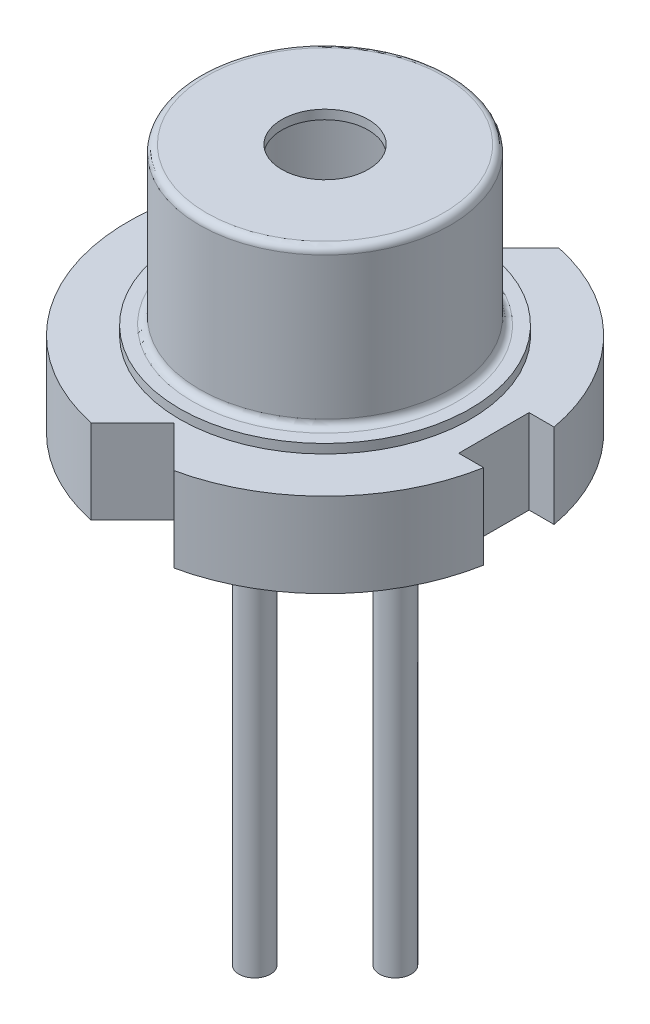
ISO-10303-21;
HEADER;
FILE_DESCRIPTION(('STEP AP214'),'2;1');
FILE_NAME('part.step','',(''),(''),'','','');
FILE_SCHEMA(('AUTOMOTIVE_DESIGN { 1 0 10303 214 1 1 1 1 }'));
ENDSEC;
DATA;
#1=APPLICATION_CONTEXT('core data for automotive mechanical design processes');
#2=APPLICATION_PROTOCOL_DEFINITION('international standard','automotive_design',2000,#1);
#3=PRODUCT_CONTEXT('',#1,'mechanical');
#4=PRODUCT('Part','Part','',(#3));
#5=PRODUCT_RELATED_PRODUCT_CATEGORY('part','',(#4));
#6=PRODUCT_DEFINITION_FORMATION('','',#4);
#7=PRODUCT_DEFINITION_CONTEXT('part definition',#1,'design');
#8=PRODUCT_DEFINITION('design','',#6,#7);
#9=PRODUCT_DEFINITION_SHAPE('','',#8);
#10=(LENGTH_UNIT() NAMED_UNIT(*) SI_UNIT(.MILLI.,.METRE.));
#11=(NAMED_UNIT(*) PLANE_ANGLE_UNIT() SI_UNIT($,.RADIAN.));
#12=(NAMED_UNIT(*) SI_UNIT($,.STERADIAN.) SOLID_ANGLE_UNIT());
#13=UNCERTAINTY_MEASURE_WITH_UNIT(LENGTH_MEASURE(1.E-05),#10,'distance_accuracy_value','');
#14=(GEOMETRIC_REPRESENTATION_CONTEXT(3) GLOBAL_UNCERTAINTY_ASSIGNED_CONTEXT((#13)) GLOBAL_UNIT_ASSIGNED_CONTEXT((#10,
#11,#12)) REPRESENTATION_CONTEXT('',''));
#15=CARTESIAN_POINT('',(0.,0.,0.));
#16=DIRECTION('',(0.,0.,1.));
#17=DIRECTION('',(1.,0.,0.));
#18=AXIS2_PLACEMENT_3D('',#15,#16,#17);
#19=CARTESIAN_POINT('',(0.,1.2,0.));
#20=DIRECTION('',(0.,-1.,0.));
#21=DIRECTION('',(0.,0.,-1.));
#22=AXIS2_PLACEMENT_3D('',#19,#20,#21);
#23=CYLINDRICAL_SURFACE('',#22,2.8);
#24=CARTESIAN_POINT('',(0.,0.,0.));
#25=DIRECTION('',(0.,1.,0.));
#26=DIRECTION('',(0.,0.,1.));
#27=AXIS2_PLACEMENT_3D('',#24,#25,#26);
#28=CIRCLE('',#27,2.8);
#29=CARTESIAN_POINT('',(-0.587640971466785,0.,-2.73764097146678));
#30=VERTEX_POINT('',#29);
#31=CARTESIAN_POINT('',(-0.587640971466782,0.,2.73764097146678));
#32=VERTEX_POINT('',#31);
#33=EDGE_CURVE('E125',#30,#32,#28,.T.);
#34=ORIENTED_EDGE('',*,*,#33,.T.);
#35=DIRECTION('',(0.,-1.,0.));
#36=VECTOR('',#35,1.);
#37=CARTESIAN_POINT('',(-0.587640971466782,1.2,2.73764097146678));
#38=LINE('',#37,#36);
#39=CARTESIAN_POINT('',(-0.587640971466782,1.2,2.73764097146678));
#40=VERTEX_POINT('',#39);
#41=EDGE_CURVE('E266',#32,#40,#38,.F.);
#42=ORIENTED_EDGE('',*,*,#41,.T.);
#43=CARTESIAN_POINT('',(0.,1.2,0.));
#44=DIRECTION('',(0.,1.,0.));
#45=DIRECTION('',(0.,0.,1.));
#46=AXIS2_PLACEMENT_3D('',#43,#44,#45);
#47=CIRCLE('',#46,2.8);
#48=CARTESIAN_POINT('',(-0.587640971466785,1.2,-2.73764097146678));
#49=VERTEX_POINT('',#48);
#50=EDGE_CURVE('E127',#49,#40,#47,.T.);
#51=ORIENTED_EDGE('',*,*,#50,.F.);
#52=DIRECTION('',(0.,-1.,0.));
#53=VECTOR('',#52,1.);
#54=CARTESIAN_POINT('',(-0.587640971466785,1.2,-2.73764097146678));
#55=LINE('',#54,#53);
#56=EDGE_CURVE('E114',#49,#30,#55,.T.);
#57=ORIENTED_EDGE('',*,*,#56,.T.);
#58=EDGE_LOOP('',(#34,#42,#51,#57));
#59=FACE_BOUND('',#58,.T.);
#60=ADVANCED_FACE('F35',(#59),#23,.T.);
#61=CARTESIAN_POINT('',(2.75499546279118,0.,-0.5));
#62=VERTEX_POINT('',#61);
#63=CARTESIAN_POINT('',(0.587640971466779,0.,-2.73764097146678));
#64=VERTEX_POINT('',#63);
#65=EDGE_CURVE('E135',#62,#64,#28,.T.);
#66=ORIENTED_EDGE('',*,*,#65,.T.);
#67=DIRECTION('',(0.,-1.,0.));
#68=VECTOR('',#67,1.);
#69=CARTESIAN_POINT('',(0.587640971466779,1.2,-2.73764097146678));
#70=LINE('',#69,#68);
#71=CARTESIAN_POINT('',(0.587640971466779,1.2,-2.73764097146678));
#72=VERTEX_POINT('',#71);
#73=EDGE_CURVE('E247',#64,#72,#70,.F.);
#74=ORIENTED_EDGE('',*,*,#73,.T.);
#75=CARTESIAN_POINT('',(2.75499546279118,1.2,-0.5));
#76=VERTEX_POINT('',#75);
#77=EDGE_CURVE('E143',#76,#72,#47,.T.);
#78=ORIENTED_EDGE('',*,*,#77,.F.);
#79=DIRECTION('',(0.,-1.,0.));
#80=VECTOR('',#79,1.);
#81=CARTESIAN_POINT('',(2.75499546279118,1.2,-0.5));
#82=LINE('',#81,#80);
#83=EDGE_CURVE('E249',#76,#62,#82,.T.);
#84=ORIENTED_EDGE('',*,*,#83,.T.);
#85=EDGE_LOOP('',(#66,#74,#78,#84));
#86=FACE_BOUND('',#85,.T.);
#87=ADVANCED_FACE('F232',(#86),#23,.T.);
#88=CARTESIAN_POINT('',(0.587640971466779,1.2,2.73764097146678));
#89=VERTEX_POINT('',#88);
#90=CARTESIAN_POINT('',(2.75499546279118,1.2,0.5));
#91=VERTEX_POINT('',#90);
#92=EDGE_CURVE('E139',#89,#91,#47,.T.);
#93=ORIENTED_EDGE('',*,*,#92,.F.);
#94=DIRECTION('',(0.,-1.,0.));
#95=VECTOR('',#94,1.);
#96=CARTESIAN_POINT('',(0.587640971466779,1.2,2.73764097146678));
#97=LINE('',#96,#95);
#98=CARTESIAN_POINT('',(0.587640971466779,0.,2.73764097146678));
#99=VERTEX_POINT('',#98);
#100=EDGE_CURVE('E258',#89,#99,#97,.T.);
#101=ORIENTED_EDGE('',*,*,#100,.T.);
#102=CARTESIAN_POINT('',(2.75499546279118,0.,0.5));
#103=VERTEX_POINT('',#102);
#104=EDGE_CURVE('E136',#99,#103,#28,.T.);
#105=ORIENTED_EDGE('',*,*,#104,.T.);
#106=DIRECTION('',(0.,-1.,0.));
#107=VECTOR('',#106,1.);
#108=CARTESIAN_POINT('',(2.75499546279118,1.2,0.5));
#109=LINE('',#108,#107);
#110=EDGE_CURVE('E279',#103,#91,#109,.F.);
#111=ORIENTED_EDGE('',*,*,#110,.T.);
#112=EDGE_LOOP('',(#93,#101,#105,#111));
#113=FACE_BOUND('',#112,.T.);
#114=ADVANCED_FACE('F223',(#113),#23,.T.);
#115=CARTESIAN_POINT('',(0.,1.2,0.));
#116=DIRECTION('',(0.,1.,0.));
#117=DIRECTION('',(0.,0.,1.));
#118=AXIS2_PLACEMENT_3D('',#115,#116,#117);
#119=PLANE('',#118);
#120=DIRECTION('',(-0.707106781186548,0.,0.707106781186548));
#121=VECTOR('',#120,1.);
#122=CARTESIAN_POINT('',(1.075,1.2,1.075));
#123=LINE('',#122,#121);
#124=CARTESIAN_POINT('',(0.,1.2,2.15));
#125=VERTEX_POINT('',#124);
#126=EDGE_CURVE('E264',#125,#40,#123,.T.);
#127=ORIENTED_EDGE('',*,*,#126,.F.);
#128=DIRECTION('',(-0.707106781186548,0.,-0.707106781186548));
#129=VECTOR('',#128,1.);
#130=CARTESIAN_POINT('',(-1.075,1.2,1.075));
#131=LINE('',#130,#129);
#132=EDGE_CURVE('E256',#89,#125,#131,.T.);
#133=ORIENTED_EDGE('',*,*,#132,.F.);
#134=ORIENTED_EDGE('',*,*,#92,.T.);
#135=DIRECTION('',(1.,0.,0.));
#136=VECTOR('',#135,1.);
#137=CARTESIAN_POINT('',(0.,1.2,0.5));
#138=LINE('',#137,#136);
#139=CARTESIAN_POINT('',(2.4,1.2,0.5));
#140=VERTEX_POINT('',#139);
#141=EDGE_CURVE('E275',#140,#91,#138,.T.);
#142=ORIENTED_EDGE('',*,*,#141,.F.);
#143=DIRECTION('',(0.,0.,1.));
#144=VECTOR('',#143,1.);
#145=CARTESIAN_POINT('',(2.4,1.2,0.));
#146=LINE('',#145,#144);
#147=CARTESIAN_POINT('',(2.4,1.2,-0.5));
#148=VERTEX_POINT('',#147);
#149=EDGE_CURVE('E282',#148,#140,#146,.T.);
#150=ORIENTED_EDGE('',*,*,#149,.F.);
#151=DIRECTION('',(-1.,0.,0.));
#152=VECTOR('',#151,1.);
#153=CARTESIAN_POINT('',(0.,1.2,-0.5));
#154=LINE('',#153,#152);
#155=EDGE_CURVE('E284',#76,#148,#154,.T.);
#156=ORIENTED_EDGE('',*,*,#155,.F.);
#157=ORIENTED_EDGE('',*,*,#77,.T.);
#158=DIRECTION('',(0.707106781186546,0.,-0.707106781186549));
#159=VECTOR('',#158,1.);
#160=CARTESIAN_POINT('',(-1.075,1.2,-1.075));
#161=LINE('',#160,#159);
#162=CARTESIAN_POINT('',(0.,1.2,-2.15));
#163=VERTEX_POINT('',#162);
#164=EDGE_CURVE('E128',#163,#72,#161,.T.);
#165=ORIENTED_EDGE('',*,*,#164,.F.);
#166=DIRECTION('',(0.707106781186551,0.,0.707106781186544));
#167=VECTOR('',#166,1.);
#168=CARTESIAN_POINT('',(1.075,1.2,-1.07500000000001));
#169=LINE('',#168,#167);
#170=EDGE_CURVE('E129',#49,#163,#169,.T.);
#171=ORIENTED_EDGE('',*,*,#170,.F.);
#172=ORIENTED_EDGE('',*,*,#50,.T.);
#173=EDGE_LOOP('',(#127,#133,#134,#142,#150,#156,#157,#165,#171,#172));
#174=FACE_BOUND('',#173,.T.);
#175=CARTESIAN_POINT('',(0.,1.2,0.));
#176=DIRECTION('',(0.,1.,0.));
#177=DIRECTION('',(0.,0.,1.));
#178=AXIS2_PLACEMENT_3D('',#175,#176,#177);
#179=CIRCLE('',#178,2.065);
#180=CARTESIAN_POINT('',(0.,1.2,2.065));
#181=VERTEX_POINT('',#180);
#182=EDGE_CURVE('E203',#181,#181,#179,.T.);
#183=ORIENTED_EDGE('',*,*,#182,.F.);
#184=EDGE_LOOP('',(#183));
#185=FACE_BOUND('',#184,.T.);
#186=ADVANCED_FACE('F221',(#174,#185),#119,.T.);
#187=CARTESIAN_POINT('',(0.,0.,0.));
#188=DIRECTION('',(0.,1.,0.));
#189=DIRECTION('',(0.,0.,1.));
#190=AXIS2_PLACEMENT_3D('',#187,#188,#189);
#191=PLANE('',#190);
#192=CARTESIAN_POINT('',(1.,0.,0.));
#193=DIRECTION('',(0.,1.,0.));
#194=DIRECTION('',(0.,0.,1.));
#195=AXIS2_PLACEMENT_3D('',#192,#193,#194);
#196=CIRCLE('',#195,0.6);
#197=CARTESIAN_POINT('',(1.,0.,0.6));
#198=VERTEX_POINT('',#197);
#199=EDGE_CURVE('E157',#198,#198,#196,.F.);
#200=ORIENTED_EDGE('',*,*,#199,.F.);
#201=EDGE_LOOP('',(#200));
#202=FACE_BOUND('',#201,.T.);
#203=CARTESIAN_POINT('',(0.,0.,-1.));
#204=DIRECTION('',(0.,1.,0.));
#205=DIRECTION('',(0.,0.,1.));
#206=AXIS2_PLACEMENT_3D('',#203,#204,#205);
#207=CIRCLE('',#206,0.4);
#208=CARTESIAN_POINT('',(0.,0.,-0.6));
#209=VERTEX_POINT('',#208);
#210=EDGE_CURVE('E148',#209,#209,#207,.F.);
#211=ORIENTED_EDGE('',*,*,#210,.F.);
#212=EDGE_LOOP('',(#211));
#213=FACE_BOUND('',#212,.T.);
#214=CARTESIAN_POINT('',(0.,0.,1.));
#215=DIRECTION('',(0.,1.,0.));
#216=DIRECTION('',(0.,0.,1.));
#217=AXIS2_PLACEMENT_3D('',#214,#215,#216);
#218=CIRCLE('',#217,0.4);
#219=CARTESIAN_POINT('',(0.,0.,1.4));
#220=VERTEX_POINT('',#219);
#221=EDGE_CURVE('E145',#220,#220,#218,.F.);
#222=ORIENTED_EDGE('',*,*,#221,.F.);
#223=EDGE_LOOP('',(#222));
#224=FACE_BOUND('',#223,.T.);
#225=DIRECTION('',(0.707106781186548,0.,0.707106781186548));
#226=VECTOR('',#225,1.);
#227=CARTESIAN_POINT('',(0.,0.,2.15));
#228=LINE('',#227,#226);
#229=CARTESIAN_POINT('',(0.,0.,2.15));
#230=VERTEX_POINT('',#229);
#231=EDGE_CURVE('E617',#230,#99,#228,.T.);
#232=ORIENTED_EDGE('',*,*,#231,.F.);
#233=DIRECTION('',(-0.707106781186548,0.,0.707106781186548));
#234=VECTOR('',#233,1.);
#235=CARTESIAN_POINT('',(1.075,0.,1.075));
#236=LINE('',#235,#234);
#237=EDGE_CURVE('E134',#230,#32,#236,.T.);
#238=ORIENTED_EDGE('',*,*,#237,.T.);
#239=ORIENTED_EDGE('',*,*,#33,.F.);
#240=DIRECTION('',(-0.707106781186551,0.,-0.707106781186544));
#241=VECTOR('',#240,1.);
#242=CARTESIAN_POINT('',(0.,0.,-2.15));
#243=LINE('',#242,#241);
#244=CARTESIAN_POINT('',(0.,0.,-2.15));
#245=VERTEX_POINT('',#244);
#246=EDGE_CURVE('E111',#245,#30,#243,.T.);
#247=ORIENTED_EDGE('',*,*,#246,.F.);
#248=DIRECTION('',(0.707106781186546,0.,-0.707106781186549));
#249=VECTOR('',#248,1.);
#250=CARTESIAN_POINT('',(-1.075,0.,-1.075));
#251=LINE('',#250,#249);
#252=EDGE_CURVE('E154',#245,#64,#251,.T.);
#253=ORIENTED_EDGE('',*,*,#252,.T.);
#254=ORIENTED_EDGE('',*,*,#65,.F.);
#255=DIRECTION('',(1.,0.,0.));
#256=VECTOR('',#255,1.);
#257=CARTESIAN_POINT('',(2.8,0.,-0.5));
#258=LINE('',#257,#256);
#259=CARTESIAN_POINT('',(2.4,0.,-0.5));
#260=VERTEX_POINT('',#259);
#261=EDGE_CURVE('E252',#260,#62,#258,.T.);
#262=ORIENTED_EDGE('',*,*,#261,.F.);
#263=DIRECTION('',(0.,0.,-1.));
#264=VECTOR('',#263,1.);
#265=CARTESIAN_POINT('',(2.4,0.,0.5));
#266=LINE('',#265,#264);
#267=CARTESIAN_POINT('',(2.4,0.,0.5));
#268=VERTEX_POINT('',#267);
#269=EDGE_CURVE('E268',#268,#260,#266,.T.);
#270=ORIENTED_EDGE('',*,*,#269,.F.);
#271=DIRECTION('',(1.,0.,0.));
#272=VECTOR('',#271,1.);
#273=CARTESIAN_POINT('',(0.,0.,0.5));
#274=LINE('',#273,#272);
#275=EDGE_CURVE('E151',#268,#103,#274,.T.);
#276=ORIENTED_EDGE('',*,*,#275,.T.);
#277=ORIENTED_EDGE('',*,*,#104,.F.);
#278=EDGE_LOOP('',(#232,#238,#239,#247,#253,#254,#262,#270,#276,#277));
#279=FACE_BOUND('',#278,.T.);
#280=ADVANCED_FACE('F133',(#202,#213,#224,#279),#191,.F.);
#281=CARTESIAN_POINT('',(0.,1.33,0.));
#282=DIRECTION('',(0.,-1.,0.));
#283=DIRECTION('',(0.,0.,-1.));
#284=AXIS2_PLACEMENT_3D('',#281,#282,#283);
#285=CYLINDRICAL_SURFACE('',#284,2.065);
#286=CARTESIAN_POINT('',(0.,1.33,0.));
#287=DIRECTION('',(0.,1.,0.));
#288=DIRECTION('',(0.,0.,1.));
#289=AXIS2_PLACEMENT_3D('',#286,#287,#288);
#290=CIRCLE('',#289,2.065);
#291=CARTESIAN_POINT('',(0.,1.33,2.065));
#292=VERTEX_POINT('',#291);
#293=EDGE_CURVE('E140',#292,#292,#290,.T.);
#294=ORIENTED_EDGE('',*,*,#293,.F.);
#295=EDGE_LOOP('',(#294));
#296=FACE_BOUND('',#295,.T.);
#297=ORIENTED_EDGE('',*,*,#182,.T.);
#298=EDGE_LOOP('',(#297));
#299=FACE_BOUND('',#298,.T.);
#300=ADVANCED_FACE('F215',(#296,#299),#285,.T.);
#301=CARTESIAN_POINT('',(0.,1.33,0.));
#302=DIRECTION('',(0.,1.,0.));
#303=DIRECTION('',(0.,0.,1.));
#304=AXIS2_PLACEMENT_3D('',#301,#302,#303);
#305=PLANE('',#304);
#306=CARTESIAN_POINT('',(0.,1.33,0.));
#307=DIRECTION('',(0.,1.,0.));
#308=DIRECTION('',(0.,0.,1.));
#309=AXIS2_PLACEMENT_3D('',#306,#307,#308);
#310=CIRCLE('',#309,1.885);
#311=CARTESIAN_POINT('',(0.,1.33,1.885));
#312=VERTEX_POINT('',#311);
#313=EDGE_CURVE('E44',#312,#312,#310,.F.);
#314=ORIENTED_EDGE('',*,*,#313,.T.);
#315=EDGE_LOOP('',(#314));
#316=FACE_BOUND('',#315,.T.);
#317=ORIENTED_EDGE('',*,*,#293,.T.);
#318=EDGE_LOOP('',(#317));
#319=FACE_BOUND('',#318,.T.);
#320=ADVANCED_FACE('F174',(#316,#319),#305,.T.);
#321=CARTESIAN_POINT('',(0.,3.55,0.));
#322=DIRECTION('',(0.,-1.,0.));
#323=DIRECTION('',(0.,0.,-1.));
#324=AXIS2_PLACEMENT_3D('',#321,#322,#323);
#325=CYLINDRICAL_SURFACE('',#324,1.785);
#326=CARTESIAN_POINT('',(0.,1.43,0.));
#327=DIRECTION('',(0.,1.,0.));
#328=DIRECTION('',(0.,0.,1.));
#329=AXIS2_PLACEMENT_3D('',#326,#327,#328);
#330=CIRCLE('',#329,1.785);
#331=CARTESIAN_POINT('',(0.,1.43,1.785));
#332=VERTEX_POINT('',#331);
#333=EDGE_CURVE('E168',#332,#332,#330,.T.);
#334=ORIENTED_EDGE('',*,*,#333,.T.);
#335=EDGE_LOOP('',(#334));
#336=FACE_BOUND('',#335,.T.);
#337=CARTESIAN_POINT('',(0.,3.45,0.));
#338=DIRECTION('',(0.,1.,0.));
#339=DIRECTION('',(0.,0.,1.));
#340=AXIS2_PLACEMENT_3D('',#337,#338,#339);
#341=CIRCLE('',#340,1.785);
#342=CARTESIAN_POINT('',(0.,3.45,1.785));
#343=VERTEX_POINT('',#342);
#344=EDGE_CURVE('E160',#343,#343,#341,.F.);
#345=ORIENTED_EDGE('',*,*,#344,.T.);
#346=EDGE_LOOP('',(#345));
#347=FACE_BOUND('',#346,.T.);
#348=ADVANCED_FACE('F183',(#336,#347),#325,.T.);
#349=CARTESIAN_POINT('',(0.,3.55,0.));
#350=DIRECTION('',(0.,1.,0.));
#351=DIRECTION('',(0.,0.,1.));
#352=AXIS2_PLACEMENT_3D('',#349,#350,#351);
#353=PLANE('',#352);
#354=CARTESIAN_POINT('',(0.,3.55,0.));
#355=DIRECTION('',(0.,1.,0.));
#356=DIRECTION('',(0.,0.,1.));
#357=AXIS2_PLACEMENT_3D('',#354,#355,#356);
#358=CIRCLE('',#357,1.685);
#359=CARTESIAN_POINT('',(0.,3.55,1.685));
#360=VERTEX_POINT('',#359);
#361=EDGE_CURVE('E11',#360,#360,#358,.T.);
#362=ORIENTED_EDGE('',*,*,#361,.T.);
#363=EDGE_LOOP('',(#362));
#364=FACE_BOUND('',#363,.T.);
#365=CARTESIAN_POINT('',(0.,3.55,0.));
#366=DIRECTION('',(0.,1.,0.));
#367=DIRECTION('',(0.,0.,1.));
#368=AXIS2_PLACEMENT_3D('',#365,#366,#367);
#369=CIRCLE('',#368,0.615);
#370=CARTESIAN_POINT('',(0.,3.55,0.615));
#371=VERTEX_POINT('',#370);
#372=EDGE_CURVE('E201',#371,#371,#369,.T.);
#373=ORIENTED_EDGE('',*,*,#372,.F.);
#374=EDGE_LOOP('',(#373));
#375=FACE_BOUND('',#374,.T.);
#376=ADVANCED_FACE('F186',(#364,#375),#353,.T.);
#377=CARTESIAN_POINT('',(0.,2.55,0.));
#378=DIRECTION('',(0.,1.,0.));
#379=DIRECTION('',(0.,0.,1.));
#380=AXIS2_PLACEMENT_3D('',#377,#378,#379);
#381=CYLINDRICAL_SURFACE('',#380,0.615);
#382=CARTESIAN_POINT('',(0.,3.42,0.));
#383=DIRECTION('',(0.,1.,0.));
#384=DIRECTION('',(0.,0.,1.));
#385=AXIS2_PLACEMENT_3D('',#382,#383,#384);
#386=CIRCLE('',#385,0.615);
#387=CARTESIAN_POINT('',(0.,3.42,0.615));
#388=VERTEX_POINT('',#387);
#389=EDGE_CURVE('E39',#388,#388,#386,.F.);
#390=ORIENTED_EDGE('',*,*,#389,.T.);
#391=EDGE_LOOP('',(#390));
#392=FACE_BOUND('',#391,.T.);
#393=ORIENTED_EDGE('',*,*,#372,.T.);
#394=EDGE_LOOP('',(#393));
#395=FACE_BOUND('',#394,.T.);
#396=ADVANCED_FACE('F197',(#392,#395),#381,.F.);
#397=CARTESIAN_POINT('',(0.,-0.05,1.));
#398=DIRECTION('',(0.,1.,0.));
#399=DIRECTION('',(0.,0.,1.));
#400=AXIS2_PLACEMENT_3D('',#397,#398,#399);
#401=CYLINDRICAL_SURFACE('',#400,0.4);
#402=CARTESIAN_POINT('',(0.,-0.05,1.));
#403=DIRECTION('',(0.,-1.,0.));
#404=DIRECTION('',(0.,0.,-1.));
#405=AXIS2_PLACEMENT_3D('',#402,#403,#404);
#406=CIRCLE('',#405,0.4);
#407=CARTESIAN_POINT('',(0.,-0.05,0.6));
#408=VERTEX_POINT('',#407);
#409=EDGE_CURVE('E204',#408,#408,#406,.T.);
#410=ORIENTED_EDGE('',*,*,#409,.F.);
#411=EDGE_LOOP('',(#410));
#412=FACE_BOUND('',#411,.T.);
#413=ORIENTED_EDGE('',*,*,#221,.T.);
#414=EDGE_LOOP('',(#413));
#415=FACE_BOUND('',#414,.T.);
#416=ADVANCED_FACE('F301',(#412,#415),#401,.T.);
#417=CARTESIAN_POINT('',(0.,-0.05,1.));
#418=DIRECTION('',(0.,-1.,0.));
#419=DIRECTION('',(0.,0.,-1.));
#420=AXIS2_PLACEMENT_3D('',#417,#418,#419);
#421=PLANE('',#420);
#422=CARTESIAN_POINT('',(0.,-0.05,1.));
#423=DIRECTION('',(0.,-1.,0.));
#424=DIRECTION('',(0.,0.,-1.));
#425=AXIS2_PLACEMENT_3D('',#422,#423,#424);
#426=CIRCLE('',#425,0.225);
#427=CARTESIAN_POINT('',(0.,-0.05,0.775));
#428=VERTEX_POINT('',#427);
#429=EDGE_CURVE('E606',#428,#428,#426,.T.);
#430=ORIENTED_EDGE('',*,*,#429,.F.);
#431=EDGE_LOOP('',(#430));
#432=FACE_BOUND('',#431,.T.);
#433=ORIENTED_EDGE('',*,*,#409,.T.);
#434=EDGE_LOOP('',(#433));
#435=FACE_BOUND('',#434,.T.);
#436=ADVANCED_FACE('F294',(#432,#435),#421,.T.);
#437=CARTESIAN_POINT('',(0.,-0.05,-1.));
#438=DIRECTION('',(0.,1.,0.));
#439=DIRECTION('',(0.,0.,1.));
#440=AXIS2_PLACEMENT_3D('',#437,#438,#439);
#441=CYLINDRICAL_SURFACE('',#440,0.4);
#442=CARTESIAN_POINT('',(0.,-0.05,-1.));
#443=DIRECTION('',(0.,-1.,0.));
#444=DIRECTION('',(0.,0.,-1.));
#445=AXIS2_PLACEMENT_3D('',#442,#443,#444);
#446=CIRCLE('',#445,0.4);
#447=CARTESIAN_POINT('',(0.,-0.05,-1.4));
#448=VERTEX_POINT('',#447);
#449=EDGE_CURVE('E208',#448,#448,#446,.T.);
#450=ORIENTED_EDGE('',*,*,#449,.F.);
#451=EDGE_LOOP('',(#450));
#452=FACE_BOUND('',#451,.T.);
#453=ORIENTED_EDGE('',*,*,#210,.T.);
#454=EDGE_LOOP('',(#453));
#455=FACE_BOUND('',#454,.T.);
#456=ADVANCED_FACE('F291',(#452,#455),#441,.T.);
#457=CARTESIAN_POINT('',(0.,-0.05,-1.));
#458=DIRECTION('',(0.,-1.,0.));
#459=DIRECTION('',(0.,0.,-1.));
#460=AXIS2_PLACEMENT_3D('',#457,#458,#459);
#461=PLANE('',#460);
#462=CARTESIAN_POINT('',(0.,-0.05,-1.));
#463=DIRECTION('',(0.,-1.,0.));
#464=DIRECTION('',(0.,0.,-1.));
#465=AXIS2_PLACEMENT_3D('',#462,#463,#464);
#466=CIRCLE('',#465,0.225);
#467=CARTESIAN_POINT('',(0.,-0.05,-1.225));
#468=VERTEX_POINT('',#467);
#469=EDGE_CURVE('E164',#468,#468,#466,.T.);
#470=ORIENTED_EDGE('',*,*,#469,.F.);
#471=EDGE_LOOP('',(#470));
#472=FACE_BOUND('',#471,.T.);
#473=ORIENTED_EDGE('',*,*,#449,.T.);
#474=EDGE_LOOP('',(#473));
#475=FACE_BOUND('',#474,.T.);
#476=ADVANCED_FACE('F289',(#472,#475),#461,.T.);
#477=CARTESIAN_POINT('',(2.8,3.55,-0.5));
#478=DIRECTION('',(0.,0.,-1.));
#479=DIRECTION('',(-1.,0.,0.));
#480=AXIS2_PLACEMENT_3D('',#477,#478,#479);
#481=PLANE('',#480);
#482=ORIENTED_EDGE('',*,*,#155,.T.);
#483=DIRECTION('',(0.,-1.,0.));
#484=VECTOR('',#483,1.);
#485=CARTESIAN_POINT('',(2.4,3.55,-0.5));
#486=LINE('',#485,#484);
#487=EDGE_CURVE('E273',#148,#260,#486,.T.);
#488=ORIENTED_EDGE('',*,*,#487,.T.);
#489=ORIENTED_EDGE('',*,*,#261,.T.);
#490=ORIENTED_EDGE('',*,*,#83,.F.);
#491=EDGE_LOOP('',(#482,#488,#489,#490));
#492=FACE_BOUND('',#491,.T.);
#493=ADVANCED_FACE('F485',(#492),#481,.F.);
#494=CARTESIAN_POINT('',(2.8,3.55,0.5));
#495=DIRECTION('',(0.,0.,1.));
#496=DIRECTION('',(1.,0.,0.));
#497=AXIS2_PLACEMENT_3D('',#494,#495,#496);
#498=PLANE('',#497);
#499=ORIENTED_EDGE('',*,*,#275,.F.);
#500=DIRECTION('',(0.,-1.,0.));
#501=VECTOR('',#500,1.);
#502=CARTESIAN_POINT('',(2.4,3.55,0.5));
#503=LINE('',#502,#501);
#504=EDGE_CURVE('E272',#140,#268,#503,.T.);
#505=ORIENTED_EDGE('',*,*,#504,.F.);
#506=ORIENTED_EDGE('',*,*,#141,.T.);
#507=ORIENTED_EDGE('',*,*,#110,.F.);
#508=EDGE_LOOP('',(#499,#505,#506,#507));
#509=FACE_BOUND('',#508,.T.);
#510=ADVANCED_FACE('F477',(#509),#498,.F.);
#511=CARTESIAN_POINT('',(2.4,3.55,0.5));
#512=DIRECTION('',(-1.,0.,0.));
#513=DIRECTION('',(0.,0.,1.));
#514=AXIS2_PLACEMENT_3D('',#511,#512,#513);
#515=PLANE('',#514);
#516=ORIENTED_EDGE('',*,*,#149,.T.);
#517=ORIENTED_EDGE('',*,*,#504,.T.);
#518=ORIENTED_EDGE('',*,*,#269,.T.);
#519=ORIENTED_EDGE('',*,*,#487,.F.);
#520=EDGE_LOOP('',(#516,#517,#518,#519));
#521=FACE_BOUND('',#520,.T.);
#522=ADVANCED_FACE('F470',(#521),#515,.F.);
#523=CARTESIAN_POINT('',(0.649999999999998,3.55,-2.8));
#524=DIRECTION('',(0.707106781186549,0.,0.707106781186546));
#525=DIRECTION('',(0.707106781186546,0.,-0.707106781186549));
#526=AXIS2_PLACEMENT_3D('',#523,#524,#525);
#527=PLANE('',#526);
#528=ORIENTED_EDGE('',*,*,#252,.F.);
#529=DIRECTION('',(0.,-1.,0.));
#530=VECTOR('',#529,1.);
#531=CARTESIAN_POINT('',(0.,3.55,-2.15));
#532=LINE('',#531,#530);
#533=EDGE_CURVE('E59',#163,#245,#532,.T.);
#534=ORIENTED_EDGE('',*,*,#533,.F.);
#535=ORIENTED_EDGE('',*,*,#164,.T.);
#536=ORIENTED_EDGE('',*,*,#73,.F.);
#537=EDGE_LOOP('',(#528,#534,#535,#536));
#538=FACE_BOUND('',#537,.T.);
#539=ADVANCED_FACE('F254',(#538),#527,.F.);
#540=CARTESIAN_POINT('',(0.,3.55,-2.15));
#541=DIRECTION('',(-0.707106781186544,0.,0.707106781186551));
#542=DIRECTION('',(0.707106781186551,0.,0.707106781186544));
#543=AXIS2_PLACEMENT_3D('',#540,#541,#542);
#544=PLANE('',#543);
#545=ORIENTED_EDGE('',*,*,#170,.T.);
#546=ORIENTED_EDGE('',*,*,#533,.T.);
#547=ORIENTED_EDGE('',*,*,#246,.T.);
#548=ORIENTED_EDGE('',*,*,#56,.F.);
#549=EDGE_LOOP('',(#545,#546,#547,#548));
#550=FACE_BOUND('',#549,.T.);
#551=ADVANCED_FACE('F113',(#550),#544,.F.);
#552=CARTESIAN_POINT('',(-0.650000000000002,3.55,2.8));
#553=DIRECTION('',(-0.707106781186547,0.,-0.707106781186547));
#554=DIRECTION('',(-0.707106781186548,0.,0.707106781186548));
#555=AXIS2_PLACEMENT_3D('',#552,#553,#554);
#556=PLANE('',#555);
#557=ORIENTED_EDGE('',*,*,#237,.F.);
#558=DIRECTION('',(0.,-1.,0.));
#559=VECTOR('',#558,1.);
#560=CARTESIAN_POINT('',(0.,3.55,2.15));
#561=LINE('',#560,#559);
#562=EDGE_CURVE('E51',#125,#230,#561,.T.);
#563=ORIENTED_EDGE('',*,*,#562,.F.);
#564=ORIENTED_EDGE('',*,*,#126,.T.);
#565=ORIENTED_EDGE('',*,*,#41,.F.);
#566=EDGE_LOOP('',(#557,#563,#564,#565));
#567=FACE_BOUND('',#566,.T.);
#568=ADVANCED_FACE('F450',(#567),#556,.F.);
#569=CARTESIAN_POINT('',(0.,3.55,2.15));
#570=DIRECTION('',(0.707106781186547,0.,-0.707106781186547));
#571=DIRECTION('',(-0.707106781186548,0.,-0.707106781186548));
#572=AXIS2_PLACEMENT_3D('',#569,#570,#571);
#573=PLANE('',#572);
#574=ORIENTED_EDGE('',*,*,#132,.T.);
#575=ORIENTED_EDGE('',*,*,#562,.T.);
#576=ORIENTED_EDGE('',*,*,#231,.T.);
#577=ORIENTED_EDGE('',*,*,#100,.F.);
#578=EDGE_LOOP('',(#574,#575,#576,#577));
#579=FACE_BOUND('',#578,.T.);
#580=ADVANCED_FACE('F440',(#579),#573,.F.);
#581=CARTESIAN_POINT('',(1.,-0.4,0.));
#582=DIRECTION('',(0.,1.,0.));
#583=DIRECTION('',(0.,0.,1.));
#584=AXIS2_PLACEMENT_3D('',#581,#582,#583);
#585=CYLINDRICAL_SURFACE('',#584,0.6);
#586=CARTESIAN_POINT('',(1.,-0.4,0.));
#587=DIRECTION('',(0.,-1.,0.));
#588=DIRECTION('',(0.,0.,-1.));
#589=AXIS2_PLACEMENT_3D('',#586,#587,#588);
#590=CIRCLE('',#589,0.6);
#591=CARTESIAN_POINT('',(1.,-0.4,-0.6));
#592=VERTEX_POINT('',#591);
#593=EDGE_CURVE('E119',#592,#592,#590,.T.);
#594=ORIENTED_EDGE('',*,*,#593,.F.);
#595=EDGE_LOOP('',(#594));
#596=FACE_BOUND('',#595,.T.);
#597=ORIENTED_EDGE('',*,*,#199,.T.);
#598=EDGE_LOOP('',(#597));
#599=FACE_BOUND('',#598,.T.);
#600=ADVANCED_FACE('F431',(#596,#599),#585,.T.);
#601=CARTESIAN_POINT('',(1.,-0.4,0.));
#602=DIRECTION('',(0.,-1.,0.));
#603=DIRECTION('',(0.,0.,-1.));
#604=AXIS2_PLACEMENT_3D('',#601,#602,#603);
#605=PLANE('',#604);
#606=CARTESIAN_POINT('',(1.,-0.4,0.));
#607=DIRECTION('',(0.,-1.,0.));
#608=DIRECTION('',(0.,0.,-1.));
#609=AXIS2_PLACEMENT_3D('',#606,#607,#608);
#610=CIRCLE('',#609,0.225);
#611=CARTESIAN_POINT('',(1.,-0.4,-0.225));
#612=VERTEX_POINT('',#611);
#613=EDGE_CURVE('E161',#612,#612,#610,.F.);
#614=ORIENTED_EDGE('',*,*,#613,.T.);
#615=EDGE_LOOP('',(#614));
#616=FACE_BOUND('',#615,.T.);
#617=ORIENTED_EDGE('',*,*,#593,.T.);
#618=EDGE_LOOP('',(#617));
#619=FACE_BOUND('',#618,.T.);
#620=ADVANCED_FACE('F423',(#616,#619),#605,.T.);
#621=CARTESIAN_POINT('',(0.,-6.05,1.));
#622=DIRECTION('',(0.,1.,0.));
#623=DIRECTION('',(0.,0.,1.));
#624=AXIS2_PLACEMENT_3D('',#621,#622,#623);
#625=CYLINDRICAL_SURFACE('',#624,0.225);
#626=CARTESIAN_POINT('',(0.,-6.05,1.));
#627=DIRECTION('',(0.,-1.,0.));
#628=DIRECTION('',(0.,0.,-1.));
#629=AXIS2_PLACEMENT_3D('',#626,#627,#628);
#630=CIRCLE('',#629,0.225);
#631=CARTESIAN_POINT('',(0.,-6.05,0.775));
#632=VERTEX_POINT('',#631);
#633=EDGE_CURVE('E610',#632,#632,#630,.T.);
#634=ORIENTED_EDGE('',*,*,#633,.F.);
#635=EDGE_LOOP('',(#634));
#636=FACE_BOUND('',#635,.T.);
#637=ORIENTED_EDGE('',*,*,#429,.T.);
#638=EDGE_LOOP('',(#637));
#639=FACE_BOUND('',#638,.T.);
#640=ADVANCED_FACE('F415',(#636,#639),#625,.T.);
#641=CARTESIAN_POINT('',(0.,-6.05,1.));
#642=DIRECTION('',(0.,-1.,0.));
#643=DIRECTION('',(0.,0.,-1.));
#644=AXIS2_PLACEMENT_3D('',#641,#642,#643);
#645=PLANE('',#644);
#646=ORIENTED_EDGE('',*,*,#633,.T.);
#647=EDGE_LOOP('',(#646));
#648=FACE_BOUND('',#647,.T.);
#649=ADVANCED_FACE('F407',(#648),#645,.T.);
#650=CARTESIAN_POINT('',(0.,-6.05,-1.));
#651=DIRECTION('',(0.,1.,0.));
#652=DIRECTION('',(0.,0.,1.));
#653=AXIS2_PLACEMENT_3D('',#650,#651,#652);
#654=CYLINDRICAL_SURFACE('',#653,0.225);
#655=CARTESIAN_POINT('',(0.,-6.05,-1.));
#656=DIRECTION('',(0.,-1.,0.));
#657=DIRECTION('',(0.,0.,-1.));
#658=AXIS2_PLACEMENT_3D('',#655,#656,#657);
#659=CIRCLE('',#658,0.225);
#660=CARTESIAN_POINT('',(0.,-6.05,-1.225));
#661=VERTEX_POINT('',#660);
#662=EDGE_CURVE('E603',#661,#661,#659,.T.);
#663=ORIENTED_EDGE('',*,*,#662,.F.);
#664=EDGE_LOOP('',(#663));
#665=FACE_BOUND('',#664,.T.);
#666=ORIENTED_EDGE('',*,*,#469,.T.);
#667=EDGE_LOOP('',(#666));
#668=FACE_BOUND('',#667,.T.);
#669=ADVANCED_FACE('F399',(#665,#668),#654,.T.);
#670=CARTESIAN_POINT('',(0.,-6.05,-1.));
#671=DIRECTION('',(0.,-1.,0.));
#672=DIRECTION('',(0.,0.,-1.));
#673=AXIS2_PLACEMENT_3D('',#670,#671,#672);
#674=PLANE('',#673);
#675=ORIENTED_EDGE('',*,*,#662,.T.);
#676=EDGE_LOOP('',(#675));
#677=FACE_BOUND('',#676,.T.);
#678=ADVANCED_FACE('F391',(#677),#674,.T.);
#679=CARTESIAN_POINT('',(1.,-6.05,0.));
#680=DIRECTION('',(0.,1.,0.));
#681=DIRECTION('',(0.,0.,1.));
#682=AXIS2_PLACEMENT_3D('',#679,#680,#681);
#683=CYLINDRICAL_SURFACE('',#682,0.225);
#684=ORIENTED_EDGE('',*,*,#613,.F.);
#685=EDGE_LOOP('',(#684));
#686=FACE_BOUND('',#685,.T.);
#687=CARTESIAN_POINT('',(1.,-6.05,0.));
#688=DIRECTION('',(0.,-1.,0.));
#689=DIRECTION('',(0.,0.,-1.));
#690=AXIS2_PLACEMENT_3D('',#687,#688,#689);
#691=CIRCLE('',#690,0.225);
#692=CARTESIAN_POINT('',(1.,-6.05,-0.225));
#693=VERTEX_POINT('',#692);
#694=EDGE_CURVE('E165',#693,#693,#691,.T.);
#695=ORIENTED_EDGE('',*,*,#694,.F.);
#696=EDGE_LOOP('',(#695));
#697=FACE_BOUND('',#696,.T.);
#698=ADVANCED_FACE('F383',(#686,#697),#683,.T.);
#699=CARTESIAN_POINT('',(1.,-6.05,0.));
#700=DIRECTION('',(0.,-1.,0.));
#701=DIRECTION('',(0.,0.,-1.));
#702=AXIS2_PLACEMENT_3D('',#699,#700,#701);
#703=PLANE('',#702);
#704=ORIENTED_EDGE('',*,*,#694,.T.);
#705=EDGE_LOOP('',(#704));
#706=FACE_BOUND('',#705,.T.);
#707=ADVANCED_FACE('F180',(#706),#703,.T.);
#708=CARTESIAN_POINT('',(0.,1.43,0.));
#709=DIRECTION('',(0.,1.,0.));
#710=DIRECTION('',(0.,0.,1.));
#711=AXIS2_PLACEMENT_3D('',#708,#709,#710);
#712=TOROIDAL_SURFACE('',#711,1.885,0.1);
#713=ORIENTED_EDGE('',*,*,#313,.F.);
#714=EDGE_LOOP('',(#713));
#715=FACE_BOUND('',#714,.T.);
#716=ORIENTED_EDGE('',*,*,#333,.F.);
#717=EDGE_LOOP('',(#716));
#718=FACE_BOUND('',#717,.T.);
#719=ADVANCED_FACE('F177',(#715,#718),#712,.F.);
#720=CARTESIAN_POINT('',(0.,3.45,0.));
#721=DIRECTION('',(0.,1.,0.));
#722=DIRECTION('',(0.,0.,1.));
#723=AXIS2_PLACEMENT_3D('',#720,#721,#722);
#724=TOROIDAL_SURFACE('',#723,1.685,0.1);
#725=ORIENTED_EDGE('',*,*,#344,.F.);
#726=EDGE_LOOP('',(#725));
#727=FACE_BOUND('',#726,.T.);
#728=ORIENTED_EDGE('',*,*,#361,.F.);
#729=EDGE_LOOP('',(#728));
#730=FACE_BOUND('',#729,.T.);
#731=ADVANCED_FACE('F37',(#727,#730),#724,.T.);
#732=CARTESIAN_POINT('',(0.,3.42,0.));
#733=DIRECTION('',(0.,1.,0.));
#734=DIRECTION('',(0.,0.,1.));
#735=AXIS2_PLACEMENT_3D('',#732,#733,#734);
#736=PLANE('',#735);
#737=CARTESIAN_POINT('',(0.,3.42,0.));
#738=DIRECTION('',(0.,1.,0.));
#739=DIRECTION('',(0.,0.,1.));
#740=AXIS2_PLACEMENT_3D('',#737,#738,#739);
#741=CIRCLE('',#740,1.655);
#742=CARTESIAN_POINT('',(0.,3.42,1.655));
#743=VERTEX_POINT('',#742);
#744=EDGE_CURVE('E644',#743,#743,#741,.T.);
#745=ORIENTED_EDGE('',*,*,#744,.F.);
#746=EDGE_LOOP('',(#745));
#747=FACE_BOUND('',#746,.T.);
#748=ORIENTED_EDGE('',*,*,#389,.F.);
#749=EDGE_LOOP('',(#748));
#750=FACE_BOUND('',#749,.T.);
#751=ADVANCED_FACE('F192',(#747,#750),#736,.F.);
#752=CARTESIAN_POINT('',(0.,3.42,0.));
#753=DIRECTION('',(0.,-1.,0.));
#754=DIRECTION('',(0.,0.,-1.));
#755=AXIS2_PLACEMENT_3D('',#752,#753,#754);
#756=CYLINDRICAL_SURFACE('',#755,1.655);
#757=ORIENTED_EDGE('',*,*,#744,.T.);
#758=EDGE_LOOP('',(#757));
#759=FACE_BOUND('',#758,.T.);
#760=CARTESIAN_POINT('',(0.,1.2,0.));
#761=DIRECTION('',(0.,1.,0.));
#762=DIRECTION('',(0.,0.,1.));
#763=AXIS2_PLACEMENT_3D('',#760,#761,#762);
#764=CIRCLE('',#763,1.655);
#765=CARTESIAN_POINT('',(0.,1.2,1.655));
#766=VERTEX_POINT('',#765);
#767=EDGE_CURVE('E641',#766,#766,#764,.T.);
#768=ORIENTED_EDGE('',*,*,#767,.F.);
#769=EDGE_LOOP('',(#768));
#770=FACE_BOUND('',#769,.T.);
#771=ADVANCED_FACE('F349',(#759,#770),#756,.F.);
#772=CARTESIAN_POINT('',(0.,1.2,0.));
#773=DIRECTION('',(0.,1.,0.));
#774=DIRECTION('',(0.,0.,1.));
#775=AXIS2_PLACEMENT_3D('',#772,#773,#774);
#776=PLANE('',#775);
#777=ORIENTED_EDGE('',*,*,#767,.T.);
#778=EDGE_LOOP('',(#777));
#779=FACE_BOUND('',#778,.T.);
#780=ADVANCED_FACE('F360',(#779),#776,.T.);
#781=CLOSED_SHELL('',(#60,#87,#114,#186,#280,#300,#320,#348,#376,#396,#416,#436,#456,#476,#493,
#510,#522,#539,#551,#568,#580,#600,#620,#640,#649,#669,#678,#698,#707,#719,#731,#751,#771,#780));
#782=MANIFOLD_SOLID_BREP('B2',#781);
#783=ADVANCED_BREP_SHAPE_REPRESENTATION('',(#18,#782),#14);
#784=SHAPE_DEFINITION_REPRESENTATION(#9,#783);
ENDSEC;
END-ISO-10303-21;
